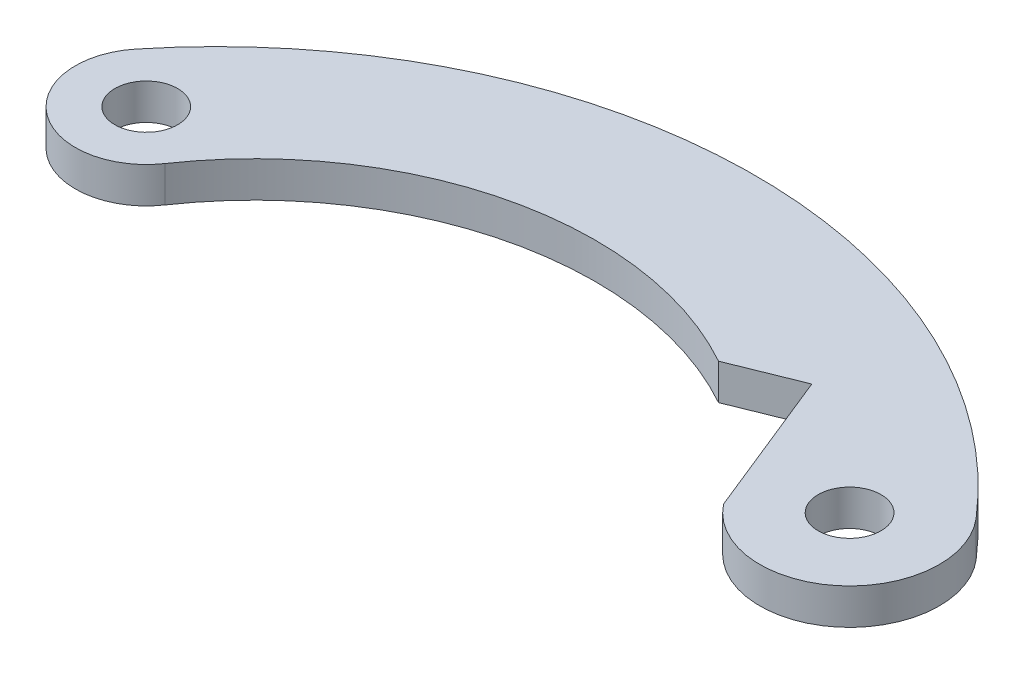
ISO-10303-21;
HEADER;
FILE_DESCRIPTION(('STEP AP214'),'2;1');
FILE_NAME('part.step','',(''),(''),'','','');
FILE_SCHEMA(('AUTOMOTIVE_DESIGN { 1 0 10303 214 1 1 1 1 }'));
ENDSEC;
DATA;
#1=APPLICATION_CONTEXT('core data for automotive mechanical design processes');
#2=APPLICATION_PROTOCOL_DEFINITION('international standard','automotive_design',2000,#1);
#3=PRODUCT_CONTEXT('',#1,'mechanical');
#4=PRODUCT('Part','Part','',(#3));
#5=PRODUCT_RELATED_PRODUCT_CATEGORY('part','',(#4));
#6=PRODUCT_DEFINITION_FORMATION('','',#4);
#7=PRODUCT_DEFINITION_CONTEXT('part definition',#1,'design');
#8=PRODUCT_DEFINITION('design','',#6,#7);
#9=PRODUCT_DEFINITION_SHAPE('','',#8);
#10=(LENGTH_UNIT() NAMED_UNIT(*) SI_UNIT(.MILLI.,.METRE.));
#11=(NAMED_UNIT(*) PLANE_ANGLE_UNIT() SI_UNIT($,.RADIAN.));
#12=(NAMED_UNIT(*) SI_UNIT($,.STERADIAN.) SOLID_ANGLE_UNIT());
#13=UNCERTAINTY_MEASURE_WITH_UNIT(LENGTH_MEASURE(1.E-05),#10,'distance_accuracy_value','');
#14=(GEOMETRIC_REPRESENTATION_CONTEXT(3) GLOBAL_UNCERTAINTY_ASSIGNED_CONTEXT((#13)) GLOBAL_UNIT_ASSIGNED_CONTEXT((#10,
#11,#12)) REPRESENTATION_CONTEXT('',''));
#15=CARTESIAN_POINT('',(0.,0.,0.));
#16=DIRECTION('',(0.,0.,1.));
#17=DIRECTION('',(1.,0.,0.));
#18=AXIS2_PLACEMENT_3D('',#15,#16,#17);
#19=CARTESIAN_POINT('',(29.0692331338659,1.,6.46565110263177));
#20=DIRECTION('',(0.,-1.,0.));
#21=DIRECTION('',(0.,0.,-1.));
#22=AXIS2_PLACEMENT_3D('',#19,#20,#21);
#23=PLANE('',#22);
#24=CARTESIAN_POINT('',(18.9600612677319,1.,12.9313022052635));
#25=DIRECTION('',(0.,-1.,0.));
#26=DIRECTION('',(0.,0.,-1.));
#27=AXIS2_PLACEMENT_3D('',#24,#25,#26);
#28=CIRCLE('',#27,19.);
#29=CARTESIAN_POINT('',(3.2632785188471,1.,2.22564896343316));
#30=VERTEX_POINT('',#29);
#31=CARTESIAN_POINT('',(28.2178554649952,1.,-3.66066110837467));
#32=VERTEX_POINT('',#31);
#33=EDGE_CURVE('E117',#30,#32,#28,.T.);
#34=ORIENTED_EDGE('',*,*,#33,.T.);
#35=DIRECTION('',(-0.927183854566789,0.,0.374606593415907));
#36=VECTOR('',#35,1.);
#37=CARTESIAN_POINT('',(31.9183730474601,1.,-5.15576726085457));
#38=LINE('',#37,#36);
#39=CARTESIAN_POINT('',(31.9183730474601,1.,-5.15576726085457));
#40=VERTEX_POINT('',#39);
#41=EDGE_CURVE('E106',#40,#32,#38,.T.);
#42=ORIENTED_EDGE('',*,*,#41,.F.);
#43=DIRECTION('',(-0.374606593415907,0.,-0.92718385456679));
#44=VECTOR('',#43,1.);
#45=CARTESIAN_POINT('',(36.1764678700901,1.,5.38338725523712));
#46=LINE('',#45,#44);
#47=CARTESIAN_POINT('',(35.2523717288617,1.,3.09616904478986));
#48=VERTEX_POINT('',#47);
#49=EDGE_CURVE('E99',#48,#40,#46,.T.);
#50=ORIENTED_EDGE('',*,*,#49,.F.);
#51=CARTESIAN_POINT('',(39.178405,1.,0.));
#52=DIRECTION('',(0.,1.,0.));
#53=DIRECTION('',(0.,0.,1.));
#54=AXIS2_PLACEMENT_3D('',#51,#52,#53);
#55=CIRCLE('',#54,5.);
#56=CARTESIAN_POINT('',(42.9594290573704,1.,-3.27167496514949));
#57=VERTEX_POINT('',#56);
#58=EDGE_CURVE('E85',#48,#57,#55,.T.);
#59=ORIENTED_EDGE('',*,*,#58,.T.);
#60=CARTESIAN_POINT('',(20.2732847131478,1.,16.3583748257475));
#61=DIRECTION('',(0.,1.,0.));
#62=DIRECTION('',(0.,0.,-1.));
#63=AXIS2_PLACEMENT_3D('',#60,#61,#62);
#64=CIRCLE('',#63,30.);
#65=CARTESIAN_POINT('',(-3.07406812349074,1.,-2.48044455131296));
#66=VERTEX_POINT('',#65);
#67=EDGE_CURVE('E145',#57,#66,#64,.T.);
#68=ORIENTED_EDGE('',*,*,#67,.T.);
#69=CARTESIAN_POINT('',(0.,1.,0.));
#70=DIRECTION('',(0.,1.,0.));
#71=DIRECTION('',(0.,0.,1.));
#72=AXIS2_PLACEMENT_3D('',#69,#70,#71);
#73=CIRCLE('',#72,3.95);
#74=EDGE_CURVE('E63',#66,#30,#73,.T.);
#75=ORIENTED_EDGE('',*,*,#74,.T.);
#76=EDGE_LOOP('',(#34,#42,#50,#59,#68,#75));
#77=FACE_BOUND('',#76,.T.);
#78=CARTESIAN_POINT('',(0.,1.,0.));
#79=DIRECTION('',(0.,1.,0.));
#80=DIRECTION('',(0.,0.,1.));
#81=AXIS2_PLACEMENT_3D('',#78,#79,#80);
#82=CIRCLE('',#81,1.75);
#83=CARTESIAN_POINT('',(0.,1.,1.75));
#84=VERTEX_POINT('',#83);
#85=EDGE_CURVE('E133',#84,#84,#82,.T.);
#86=ORIENTED_EDGE('',*,*,#85,.F.);
#87=EDGE_LOOP('',(#86));
#88=FACE_BOUND('',#87,.T.);
#89=CARTESIAN_POINT('',(39.178405,1.,0.));
#90=DIRECTION('',(0.,1.,0.));
#91=DIRECTION('',(0.,0.,1.));
#92=AXIS2_PLACEMENT_3D('',#89,#90,#91);
#93=CIRCLE('',#92,1.75);
#94=CARTESIAN_POINT('',(39.178405,1.,1.75));
#95=VERTEX_POINT('',#94);
#96=EDGE_CURVE('E125',#95,#95,#93,.T.);
#97=ORIENTED_EDGE('',*,*,#96,.F.);
#98=EDGE_LOOP('',(#97));
#99=FACE_BOUND('',#98,.T.);
#100=ADVANCED_FACE('F38',(#77,#88,#99),#23,.F.);
#101=CARTESIAN_POINT('',(29.0692331338659,-1.,6.46565110263177));
#102=DIRECTION('',(0.,-1.,0.));
#103=DIRECTION('',(0.,0.,-1.));
#104=AXIS2_PLACEMENT_3D('',#101,#102,#103);
#105=PLANE('',#104);
#106=DIRECTION('',(-0.927183854566789,0.,0.374606593415907));
#107=VECTOR('',#106,1.);
#108=CARTESIAN_POINT('',(31.9183730474601,-1.,-5.15576726085457));
#109=LINE('',#108,#107);
#110=CARTESIAN_POINT('',(31.9183730474601,-1.,-5.15576726085457));
#111=VERTEX_POINT('',#110);
#112=CARTESIAN_POINT('',(28.2178554649952,-1.,-3.66066110837467));
#113=VERTEX_POINT('',#112);
#114=EDGE_CURVE('E111',#111,#113,#109,.T.);
#115=ORIENTED_EDGE('',*,*,#114,.T.);
#116=CARTESIAN_POINT('',(18.9600612677319,-1.,12.9313022052635));
#117=DIRECTION('',(0.,-1.,0.));
#118=DIRECTION('',(0.,0.,-1.));
#119=AXIS2_PLACEMENT_3D('',#116,#117,#118);
#120=CIRCLE('',#119,19.);
#121=CARTESIAN_POINT('',(3.2632785188471,-1.,2.22564896343316));
#122=VERTEX_POINT('',#121);
#123=EDGE_CURVE('E137',#122,#113,#120,.T.);
#124=ORIENTED_EDGE('',*,*,#123,.F.);
#125=CARTESIAN_POINT('',(0.,-1.,0.));
#126=DIRECTION('',(0.,1.,0.));
#127=DIRECTION('',(0.,0.,1.));
#128=AXIS2_PLACEMENT_3D('',#125,#126,#127);
#129=CIRCLE('',#128,3.95);
#130=CARTESIAN_POINT('',(-3.07406812349074,-1.,-2.48044455131296));
#131=VERTEX_POINT('',#130);
#132=EDGE_CURVE('E80',#131,#122,#129,.T.);
#133=ORIENTED_EDGE('',*,*,#132,.F.);
#134=CARTESIAN_POINT('',(20.2732847131478,-1.,16.3583748257475));
#135=DIRECTION('',(0.,1.,0.));
#136=DIRECTION('',(0.,0.,-1.));
#137=AXIS2_PLACEMENT_3D('',#134,#135,#136);
#138=CIRCLE('',#137,30.);
#139=CARTESIAN_POINT('',(42.9594290573704,-1.,-3.27167496514949));
#140=VERTEX_POINT('',#139);
#141=EDGE_CURVE('E157',#140,#131,#138,.T.);
#142=ORIENTED_EDGE('',*,*,#141,.F.);
#143=CARTESIAN_POINT('',(39.178405,-1.,0.));
#144=DIRECTION('',(0.,1.,0.));
#145=DIRECTION('',(0.,0.,1.));
#146=AXIS2_PLACEMENT_3D('',#143,#144,#145);
#147=CIRCLE('',#146,5.);
#148=CARTESIAN_POINT('',(35.2523717288617,-1.,3.09616904478986));
#149=VERTEX_POINT('',#148);
#150=EDGE_CURVE('E154',#149,#140,#147,.T.);
#151=ORIENTED_EDGE('',*,*,#150,.F.);
#152=DIRECTION('',(-0.374606593415907,0.,-0.92718385456679));
#153=VECTOR('',#152,1.);
#154=CARTESIAN_POINT('',(36.1764678700901,-1.,5.38338725523712));
#155=LINE('',#154,#153);
#156=EDGE_CURVE('E54',#149,#111,#155,.T.);
#157=ORIENTED_EDGE('',*,*,#156,.T.);
#158=EDGE_LOOP('',(#115,#124,#133,#142,#151,#157));
#159=FACE_BOUND('',#158,.T.);
#160=CARTESIAN_POINT('',(0.,-1.,0.));
#161=DIRECTION('',(0.,1.,0.));
#162=DIRECTION('',(0.,0.,1.));
#163=AXIS2_PLACEMENT_3D('',#160,#161,#162);
#164=CIRCLE('',#163,1.75);
#165=CARTESIAN_POINT('',(0.,-1.,1.75));
#166=VERTEX_POINT('',#165);
#167=EDGE_CURVE('E129',#166,#166,#164,.T.);
#168=ORIENTED_EDGE('',*,*,#167,.T.);
#169=EDGE_LOOP('',(#168));
#170=FACE_BOUND('',#169,.T.);
#171=CARTESIAN_POINT('',(39.178405,-1.,0.));
#172=DIRECTION('',(0.,1.,0.));
#173=DIRECTION('',(0.,0.,1.));
#174=AXIS2_PLACEMENT_3D('',#171,#172,#173);
#175=CIRCLE('',#174,1.75);
#176=CARTESIAN_POINT('',(39.178405,-1.,1.75));
#177=VERTEX_POINT('',#176);
#178=EDGE_CURVE('E113',#177,#177,#175,.T.);
#179=ORIENTED_EDGE('',*,*,#178,.T.);
#180=EDGE_LOOP('',(#179));
#181=FACE_BOUND('',#180,.T.);
#182=ADVANCED_FACE('F176',(#159,#170,#181),#105,.T.);
#183=CARTESIAN_POINT('',(18.9600612677319,1.,12.9313022052635));
#184=DIRECTION('',(0.,-1.,0.));
#185=DIRECTION('',(0.,0.,-1.));
#186=AXIS2_PLACEMENT_3D('',#183,#184,#185);
#187=CYLINDRICAL_SURFACE('',#186,19.);
#188=ORIENTED_EDGE('',*,*,#123,.T.);
#189=DIRECTION('',(0.,-1.,0.));
#190=VECTOR('',#189,1.);
#191=CARTESIAN_POINT('',(28.2178554649952,1.,-3.66066110837467));
#192=LINE('',#191,#190);
#193=EDGE_CURVE('E11',#113,#32,#192,.F.);
#194=ORIENTED_EDGE('',*,*,#193,.T.);
#195=ORIENTED_EDGE('',*,*,#33,.F.);
#196=DIRECTION('',(0.,-1.,0.));
#197=VECTOR('',#196,1.);
#198=CARTESIAN_POINT('',(3.2632785188471,1.,2.22564896343316));
#199=LINE('',#198,#197);
#200=EDGE_CURVE('E150',#30,#122,#199,.T.);
#201=ORIENTED_EDGE('',*,*,#200,.T.);
#202=EDGE_LOOP('',(#188,#194,#195,#201));
#203=FACE_BOUND('',#202,.T.);
#204=ADVANCED_FACE('F40',(#203),#187,.F.);
#205=CARTESIAN_POINT('',(39.178405,1.,0.));
#206=DIRECTION('',(0.,-1.,0.));
#207=DIRECTION('',(0.,0.,-1.));
#208=AXIS2_PLACEMENT_3D('',#205,#206,#207);
#209=CYLINDRICAL_SURFACE('',#208,5.);
#210=ORIENTED_EDGE('',*,*,#58,.F.);
#211=DIRECTION('',(0.,-1.,0.));
#212=VECTOR('',#211,1.);
#213=CARTESIAN_POINT('',(35.2523717288617,1.,3.09616904478986));
#214=LINE('',#213,#212);
#215=EDGE_CURVE('E47',#48,#149,#214,.T.);
#216=ORIENTED_EDGE('',*,*,#215,.T.);
#217=ORIENTED_EDGE('',*,*,#150,.T.);
#218=DIRECTION('',(0.,-1.,0.));
#219=VECTOR('',#218,1.);
#220=CARTESIAN_POINT('',(42.9594290573704,1.,-3.27167496514949));
#221=LINE('',#220,#219);
#222=EDGE_CURVE('E167',#57,#140,#221,.T.);
#223=ORIENTED_EDGE('',*,*,#222,.F.);
#224=EDGE_LOOP('',(#210,#216,#217,#223));
#225=FACE_BOUND('',#224,.T.);
#226=ADVANCED_FACE('F173',(#225),#209,.T.);
#227=CARTESIAN_POINT('',(20.2732847131478,1.,16.3583748257475));
#228=DIRECTION('',(0.,-1.,0.));
#229=DIRECTION('',(0.,0.,-1.));
#230=AXIS2_PLACEMENT_3D('',#227,#228,#229);
#231=CYLINDRICAL_SURFACE('',#230,30.);
#232=ORIENTED_EDGE('',*,*,#141,.T.);
#233=DIRECTION('',(0.,-1.,0.));
#234=VECTOR('',#233,1.);
#235=CARTESIAN_POINT('',(-3.07406812349074,1.,-2.48044455131296));
#236=LINE('',#235,#234);
#237=EDGE_CURVE('E164',#66,#131,#236,.T.);
#238=ORIENTED_EDGE('',*,*,#237,.F.);
#239=ORIENTED_EDGE('',*,*,#67,.F.);
#240=ORIENTED_EDGE('',*,*,#222,.T.);
#241=EDGE_LOOP('',(#232,#238,#239,#240));
#242=FACE_BOUND('',#241,.T.);
#243=ADVANCED_FACE('F181',(#242),#231,.T.);
#244=CARTESIAN_POINT('',(0.,1.,0.));
#245=DIRECTION('',(0.,-1.,0.));
#246=DIRECTION('',(0.,0.,-1.));
#247=AXIS2_PLACEMENT_3D('',#244,#245,#246);
#248=CYLINDRICAL_SURFACE('',#247,3.95);
#249=ORIENTED_EDGE('',*,*,#132,.T.);
#250=ORIENTED_EDGE('',*,*,#200,.F.);
#251=ORIENTED_EDGE('',*,*,#74,.F.);
#252=ORIENTED_EDGE('',*,*,#237,.T.);
#253=EDGE_LOOP('',(#249,#250,#251,#252));
#254=FACE_BOUND('',#253,.T.);
#255=ADVANCED_FACE('F183',(#254),#248,.T.);
#256=CARTESIAN_POINT('',(0.,1.,0.));
#257=DIRECTION('',(0.,-1.,0.));
#258=DIRECTION('',(0.,0.,-1.));
#259=AXIS2_PLACEMENT_3D('',#256,#257,#258);
#260=CYLINDRICAL_SURFACE('',#259,1.75);
#261=ORIENTED_EDGE('',*,*,#85,.T.);
#262=EDGE_LOOP('',(#261));
#263=FACE_BOUND('',#262,.T.);
#264=ORIENTED_EDGE('',*,*,#167,.F.);
#265=EDGE_LOOP('',(#264));
#266=FACE_BOUND('',#265,.T.);
#267=ADVANCED_FACE('F197',(#263,#266),#260,.F.);
#268=CARTESIAN_POINT('',(39.178405,1.,0.));
#269=DIRECTION('',(0.,-1.,0.));
#270=DIRECTION('',(0.,0.,-1.));
#271=AXIS2_PLACEMENT_3D('',#268,#269,#270);
#272=CYLINDRICAL_SURFACE('',#271,1.75);
#273=ORIENTED_EDGE('',*,*,#96,.T.);
#274=EDGE_LOOP('',(#273));
#275=FACE_BOUND('',#274,.T.);
#276=ORIENTED_EDGE('',*,*,#178,.F.);
#277=EDGE_LOOP('',(#276));
#278=FACE_BOUND('',#277,.T.);
#279=ADVANCED_FACE('F218',(#275,#278),#272,.F.);
#280=CARTESIAN_POINT('',(31.9183730474601,-1.,-5.15576726085457));
#281=DIRECTION('',(-0.374606593415907,0.,-0.927183854566789));
#282=DIRECTION('',(-0.92718385456679,0.,0.374606593415907));
#283=AXIS2_PLACEMENT_3D('',#280,#281,#282);
#284=PLANE('',#283);
#285=ORIENTED_EDGE('',*,*,#114,.F.);
#286=DIRECTION('',(0.,1.,0.));
#287=VECTOR('',#286,1.);
#288=CARTESIAN_POINT('',(31.9183730474601,-1.,-5.15576726085457));
#289=LINE('',#288,#287);
#290=EDGE_CURVE('E102',#111,#40,#289,.T.);
#291=ORIENTED_EDGE('',*,*,#290,.T.);
#292=ORIENTED_EDGE('',*,*,#41,.T.);
#293=ORIENTED_EDGE('',*,*,#193,.F.);
#294=EDGE_LOOP('',(#285,#291,#292,#293));
#295=FACE_BOUND('',#294,.T.);
#296=ADVANCED_FACE('F109',(#295),#284,.F.);
#297=CARTESIAN_POINT('',(36.1764678700901,-1.,5.38338725523712));
#298=DIRECTION('',(0.92718385456679,0.,-0.374606593415906));
#299=DIRECTION('',(-0.374606593415906,0.,-0.92718385456679));
#300=AXIS2_PLACEMENT_3D('',#297,#298,#299);
#301=PLANE('',#300);
#302=ORIENTED_EDGE('',*,*,#49,.T.);
#303=ORIENTED_EDGE('',*,*,#290,.F.);
#304=ORIENTED_EDGE('',*,*,#156,.F.);
#305=ORIENTED_EDGE('',*,*,#215,.F.);
#306=EDGE_LOOP('',(#302,#303,#304,#305));
#307=FACE_BOUND('',#306,.T.);
#308=ADVANCED_FACE('F101',(#307),#301,.F.);
#309=CLOSED_SHELL('',(#100,#182,#204,#226,#243,#255,#267,#279,#296,#308));
#310=MANIFOLD_SOLID_BREP('B2',#309);
#311=ADVANCED_BREP_SHAPE_REPRESENTATION('',(#18,#310),#14);
#312=SHAPE_DEFINITION_REPRESENTATION(#9,#311);
ENDSEC;
END-ISO-10303-21;
